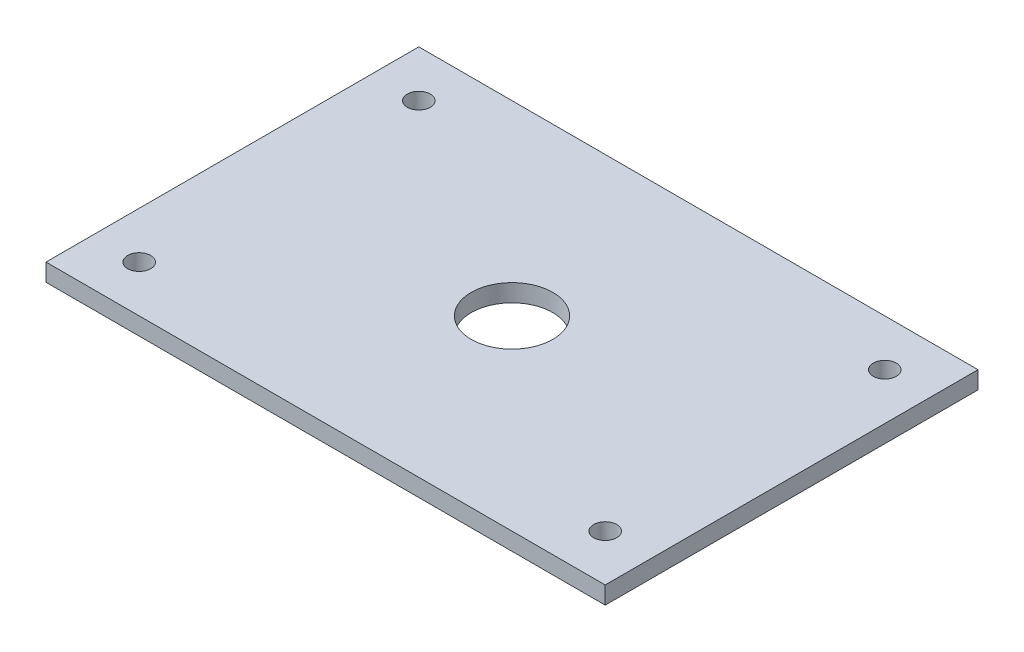
ISO-10303-21;
HEADER;
FILE_DESCRIPTION(('STEP AP214'),'2;1');
FILE_NAME('part.step','',(''),(''),'','','');
FILE_SCHEMA(('AUTOMOTIVE_DESIGN { 1 0 10303 214 1 1 1 1 }'));
ENDSEC;
DATA;
#1=APPLICATION_CONTEXT('core data for automotive mechanical design processes');
#2=APPLICATION_PROTOCOL_DEFINITION('international standard','automotive_design',2000,#1);
#3=PRODUCT_CONTEXT('',#1,'mechanical');
#4=PRODUCT('Part','Part','',(#3));
#5=PRODUCT_RELATED_PRODUCT_CATEGORY('part','',(#4));
#6=PRODUCT_DEFINITION_FORMATION('','',#4);
#7=PRODUCT_DEFINITION_CONTEXT('part definition',#1,'design');
#8=PRODUCT_DEFINITION('design','',#6,#7);
#9=PRODUCT_DEFINITION_SHAPE('','',#8);
#10=(LENGTH_UNIT() NAMED_UNIT(*) SI_UNIT(.MILLI.,.METRE.));
#11=(NAMED_UNIT(*) PLANE_ANGLE_UNIT() SI_UNIT($,.RADIAN.));
#12=(NAMED_UNIT(*) SI_UNIT($,.STERADIAN.) SOLID_ANGLE_UNIT());
#13=UNCERTAINTY_MEASURE_WITH_UNIT(LENGTH_MEASURE(1.E-05),#10,'distance_accuracy_value','');
#14=(GEOMETRIC_REPRESENTATION_CONTEXT(3) GLOBAL_UNCERTAINTY_ASSIGNED_CONTEXT((#13)) GLOBAL_UNIT_ASSIGNED_CONTEXT((#10,
#11,#12)) REPRESENTATION_CONTEXT('',''));
#15=CARTESIAN_POINT('',(0.,0.,0.));
#16=DIRECTION('',(0.,0.,1.));
#17=DIRECTION('',(1.,0.,0.));
#18=AXIS2_PLACEMENT_3D('',#15,#16,#17);
#19=CARTESIAN_POINT('',(-57.4360360360361,4.7752,-29.2900900900901));
#20=DIRECTION('',(1.,0.,0.));
#21=DIRECTION('',(0.,0.,-1.));
#22=AXIS2_PLACEMENT_3D('',#19,#20,#21);
#23=PLANE('',#22);
#24=DIRECTION('',(0.,0.,1.));
#25=VECTOR('',#24,1.);
#26=CARTESIAN_POINT('',(-57.4360360360361,0.,-29.2900900900901));
#27=LINE('',#26,#25);
#28=CARTESIAN_POINT('',(-57.4360360360361,0.,-29.2900900900901));
#29=VERTEX_POINT('',#28);
#30=CARTESIAN_POINT('',(-57.436036036036,0.,72.3099099099099));
#31=VERTEX_POINT('',#30);
#32=EDGE_CURVE('E99',#29,#31,#27,.T.);
#33=ORIENTED_EDGE('',*,*,#32,.T.);
#34=DIRECTION('',(0.,-1.,0.));
#35=VECTOR('',#34,1.);
#36=CARTESIAN_POINT('',(-57.436036036036,4.7752,72.3099099099099));
#37=LINE('',#36,#35);
#38=CARTESIAN_POINT('',(-57.436036036036,4.7752,72.3099099099099));
#39=VERTEX_POINT('',#38);
#40=EDGE_CURVE('E11',#39,#31,#37,.T.);
#41=ORIENTED_EDGE('',*,*,#40,.F.);
#42=DIRECTION('',(0.,0.,1.));
#43=VECTOR('',#42,1.);
#44=CARTESIAN_POINT('',(-57.4360360360361,4.7752,-29.2900900900901));
#45=LINE('',#44,#43);
#46=CARTESIAN_POINT('',(-57.4360360360361,4.7752,-29.2900900900901));
#47=VERTEX_POINT('',#46);
#48=EDGE_CURVE('E87',#47,#39,#45,.T.);
#49=ORIENTED_EDGE('',*,*,#48,.F.);
#50=DIRECTION('',(0.,-1.,0.));
#51=VECTOR('',#50,1.);
#52=CARTESIAN_POINT('',(-57.4360360360361,4.7752,-29.2900900900901));
#53=LINE('',#52,#51);
#54=EDGE_CURVE('E95',#47,#29,#53,.T.);
#55=ORIENTED_EDGE('',*,*,#54,.T.);
#56=EDGE_LOOP('',(#33,#41,#49,#55));
#57=FACE_BOUND('',#56,.T.);
#58=ADVANCED_FACE('F36',(#57),#23,.F.);
#59=CARTESIAN_POINT('',(-57.436036036036,4.7752,72.3099099099099));
#60=DIRECTION('',(0.,0.,-1.));
#61=DIRECTION('',(-1.,0.,0.));
#62=AXIS2_PLACEMENT_3D('',#59,#60,#61);
#63=PLANE('',#62);
#64=DIRECTION('',(1.,0.,0.));
#65=VECTOR('',#64,1.);
#66=CARTESIAN_POINT('',(-57.436036036036,0.,72.3099099099099));
#67=LINE('',#66,#65);
#68=CARTESIAN_POINT('',(94.9639639639639,0.,72.3099099099099));
#69=VERTEX_POINT('',#68);
#70=EDGE_CURVE('E91',#31,#69,#67,.T.);
#71=ORIENTED_EDGE('',*,*,#70,.T.);
#72=DIRECTION('',(0.,-1.,0.));
#73=VECTOR('',#72,1.);
#74=CARTESIAN_POINT('',(94.9639639639639,4.7752,72.3099099099099));
#75=LINE('',#74,#73);
#76=CARTESIAN_POINT('',(94.9639639639639,4.7752,72.3099099099099));
#77=VERTEX_POINT('',#76);
#78=EDGE_CURVE('E44',#77,#69,#75,.T.);
#79=ORIENTED_EDGE('',*,*,#78,.F.);
#80=DIRECTION('',(1.,0.,0.));
#81=VECTOR('',#80,1.);
#82=CARTESIAN_POINT('',(-57.436036036036,4.7752,72.3099099099099));
#83=LINE('',#82,#81);
#84=EDGE_CURVE('E82',#39,#77,#83,.T.);
#85=ORIENTED_EDGE('',*,*,#84,.F.);
#86=ORIENTED_EDGE('',*,*,#40,.T.);
#87=EDGE_LOOP('',(#71,#79,#85,#86));
#88=FACE_BOUND('',#87,.T.);
#89=ADVANCED_FACE('F90',(#88),#63,.F.);
#90=CARTESIAN_POINT('',(94.9639639639639,4.7752,-29.2900900900901));
#91=DIRECTION('',(-1.,0.,0.));
#92=DIRECTION('',(0.,0.,1.));
#93=AXIS2_PLACEMENT_3D('',#90,#91,#92);
#94=PLANE('',#93);
#95=DIRECTION('',(0.,0.,-1.));
#96=VECTOR('',#95,1.);
#97=CARTESIAN_POINT('',(94.9639639639639,0.,-29.2900900900901));
#98=LINE('',#97,#96);
#99=CARTESIAN_POINT('',(94.9639639639639,0.,-29.2900900900901));
#100=VERTEX_POINT('',#99);
#101=EDGE_CURVE('E69',#69,#100,#98,.T.);
#102=ORIENTED_EDGE('',*,*,#101,.T.);
#103=DIRECTION('',(0.,-1.,0.));
#104=VECTOR('',#103,1.);
#105=CARTESIAN_POINT('',(94.9639639639639,4.7752,-29.2900900900901));
#106=LINE('',#105,#104);
#107=CARTESIAN_POINT('',(94.9639639639639,4.7752,-29.2900900900901));
#108=VERTEX_POINT('',#107);
#109=EDGE_CURVE('E92',#108,#100,#106,.T.);
#110=ORIENTED_EDGE('',*,*,#109,.F.);
#111=DIRECTION('',(0.,0.,-1.));
#112=VECTOR('',#111,1.);
#113=CARTESIAN_POINT('',(94.9639639639639,4.7752,-29.2900900900901));
#114=LINE('',#113,#112);
#115=EDGE_CURVE('E85',#77,#108,#114,.T.);
#116=ORIENTED_EDGE('',*,*,#115,.F.);
#117=ORIENTED_EDGE('',*,*,#78,.T.);
#118=EDGE_LOOP('',(#102,#110,#116,#117));
#119=FACE_BOUND('',#118,.T.);
#120=ADVANCED_FACE('F93',(#119),#94,.F.);
#121=CARTESIAN_POINT('',(-57.4360360360361,4.7752,-29.2900900900901));
#122=DIRECTION('',(0.,0.,1.));
#123=DIRECTION('',(1.,0.,0.));
#124=AXIS2_PLACEMENT_3D('',#121,#122,#123);
#125=PLANE('',#124);
#126=DIRECTION('',(-1.,0.,0.));
#127=VECTOR('',#126,1.);
#128=CARTESIAN_POINT('',(-57.4360360360361,0.,-29.2900900900901));
#129=LINE('',#128,#127);
#130=EDGE_CURVE('E75',#100,#29,#129,.T.);
#131=ORIENTED_EDGE('',*,*,#130,.T.);
#132=ORIENTED_EDGE('',*,*,#54,.F.);
#133=DIRECTION('',(-1.,0.,0.));
#134=VECTOR('',#133,1.);
#135=CARTESIAN_POINT('',(-57.4360360360361,4.7752,-29.2900900900901));
#136=LINE('',#135,#134);
#137=EDGE_CURVE('E52',#108,#47,#136,.T.);
#138=ORIENTED_EDGE('',*,*,#137,.F.);
#139=ORIENTED_EDGE('',*,*,#109,.T.);
#140=EDGE_LOOP('',(#131,#132,#138,#139));
#141=FACE_BOUND('',#140,.T.);
#142=ADVANCED_FACE('F107',(#141),#125,.F.);
#143=CARTESIAN_POINT('',(0.,4.7752,0.));
#144=DIRECTION('',(0.,1.,0.));
#145=DIRECTION('',(0.,0.,1.));
#146=AXIS2_PLACEMENT_3D('',#143,#144,#145);
#147=PLANE('',#146);
#148=CARTESIAN_POINT('',(-44.7360360360353,4.7752,59.6099099099099));
#149=DIRECTION('',(0.,1.,0.));
#150=DIRECTION('',(0.,0.,1.));
#151=AXIS2_PLACEMENT_3D('',#148,#149,#150);
#152=CIRCLE('',#151,3.1369);
#153=CARTESIAN_POINT('',(-44.7360360360353,4.7752,62.7468099099099));
#154=VERTEX_POINT('',#153);
#155=EDGE_CURVE('E119',#154,#154,#152,.T.);
#156=ORIENTED_EDGE('',*,*,#155,.F.);
#157=EDGE_LOOP('',(#156));
#158=FACE_BOUND('',#157,.T.);
#159=CARTESIAN_POINT('',(82.2639639639648,4.7752,59.6099099099099));
#160=DIRECTION('',(0.,1.,0.));
#161=DIRECTION('',(0.,0.,1.));
#162=AXIS2_PLACEMENT_3D('',#159,#160,#161);
#163=CIRCLE('',#162,3.13689999999999);
#164=CARTESIAN_POINT('',(82.2639639639648,4.7752,62.7468099099099));
#165=VERTEX_POINT('',#164);
#166=EDGE_CURVE('E125',#165,#165,#163,.T.);
#167=ORIENTED_EDGE('',*,*,#166,.F.);
#168=EDGE_LOOP('',(#167));
#169=FACE_BOUND('',#168,.T.);
#170=CARTESIAN_POINT('',(82.2639639639639,4.7752,-16.5900900900901));
#171=DIRECTION('',(0.,1.,0.));
#172=DIRECTION('',(0.,0.,1.));
#173=AXIS2_PLACEMENT_3D('',#170,#171,#172);
#174=CIRCLE('',#173,3.13689999999999);
#175=CARTESIAN_POINT('',(82.2639639639639,4.7752,-13.4531900900901));
#176=VERTEX_POINT('',#175);
#177=EDGE_CURVE('E131',#176,#176,#174,.T.);
#178=ORIENTED_EDGE('',*,*,#177,.F.);
#179=EDGE_LOOP('',(#178));
#180=FACE_BOUND('',#179,.T.);
#181=CARTESIAN_POINT('',(18.7639639639639,4.7752,21.5099099099099));
#182=DIRECTION('',(0.,1.,0.));
#183=DIRECTION('',(0.,0.,1.));
#184=AXIS2_PLACEMENT_3D('',#181,#182,#183);
#185=CIRCLE('',#184,11.1125);
#186=CARTESIAN_POINT('',(18.7639639639639,4.7752,32.6224099099099));
#187=VERTEX_POINT('',#186);
#188=EDGE_CURVE('E137',#187,#187,#185,.T.);
#189=ORIENTED_EDGE('',*,*,#188,.F.);
#190=EDGE_LOOP('',(#189));
#191=FACE_BOUND('',#190,.T.);
#192=CARTESIAN_POINT('',(-44.7360360360361,4.7752,-16.5900900900901));
#193=DIRECTION('',(0.,1.,0.));
#194=DIRECTION('',(0.,0.,1.));
#195=AXIS2_PLACEMENT_3D('',#192,#193,#194);
#196=CIRCLE('',#195,3.1369);
#197=CARTESIAN_POINT('',(-44.7360360360361,4.7752,-13.4531900900901));
#198=VERTEX_POINT('',#197);
#199=EDGE_CURVE('E113',#198,#198,#196,.T.);
#200=ORIENTED_EDGE('',*,*,#199,.F.);
#201=EDGE_LOOP('',(#200));
#202=FACE_BOUND('',#201,.T.);
#203=ORIENTED_EDGE('',*,*,#48,.T.);
#204=ORIENTED_EDGE('',*,*,#84,.T.);
#205=ORIENTED_EDGE('',*,*,#115,.T.);
#206=ORIENTED_EDGE('',*,*,#137,.T.);
#207=EDGE_LOOP('',(#203,#204,#205,#206));
#208=FACE_BOUND('',#207,.T.);
#209=ADVANCED_FACE('F83',(#158,#169,#180,#191,#202,#208),#147,.T.);
#210=CARTESIAN_POINT('',(0.,0.,0.));
#211=DIRECTION('',(0.,1.,0.));
#212=DIRECTION('',(0.,0.,1.));
#213=AXIS2_PLACEMENT_3D('',#210,#211,#212);
#214=PLANE('',#213);
#215=CARTESIAN_POINT('',(-44.7360360360353,0.,59.6099099099099));
#216=DIRECTION('',(0.,1.,0.));
#217=DIRECTION('',(0.,0.,1.));
#218=AXIS2_PLACEMENT_3D('',#215,#216,#217);
#219=CIRCLE('',#218,3.1369);
#220=CARTESIAN_POINT('',(-44.7360360360353,0.,62.7468099099099));
#221=VERTEX_POINT('',#220);
#222=EDGE_CURVE('E122',#221,#221,#219,.T.);
#223=ORIENTED_EDGE('',*,*,#222,.T.);
#224=EDGE_LOOP('',(#223));
#225=FACE_BOUND('',#224,.T.);
#226=CARTESIAN_POINT('',(82.2639639639648,0.,59.6099099099099));
#227=DIRECTION('',(0.,1.,0.));
#228=DIRECTION('',(0.,0.,1.));
#229=AXIS2_PLACEMENT_3D('',#226,#227,#228);
#230=CIRCLE('',#229,3.13689999999999);
#231=CARTESIAN_POINT('',(82.2639639639648,0.,62.7468099099099));
#232=VERTEX_POINT('',#231);
#233=EDGE_CURVE('E128',#232,#232,#230,.T.);
#234=ORIENTED_EDGE('',*,*,#233,.T.);
#235=EDGE_LOOP('',(#234));
#236=FACE_BOUND('',#235,.T.);
#237=CARTESIAN_POINT('',(82.2639639639639,0.,-16.5900900900901));
#238=DIRECTION('',(0.,1.,0.));
#239=DIRECTION('',(0.,0.,1.));
#240=AXIS2_PLACEMENT_3D('',#237,#238,#239);
#241=CIRCLE('',#240,3.13689999999999);
#242=CARTESIAN_POINT('',(82.2639639639639,0.,-13.4531900900901));
#243=VERTEX_POINT('',#242);
#244=EDGE_CURVE('E134',#243,#243,#241,.T.);
#245=ORIENTED_EDGE('',*,*,#244,.T.);
#246=EDGE_LOOP('',(#245));
#247=FACE_BOUND('',#246,.T.);
#248=CARTESIAN_POINT('',(18.7639639639639,0.,21.5099099099099));
#249=DIRECTION('',(0.,1.,0.));
#250=DIRECTION('',(0.,0.,1.));
#251=AXIS2_PLACEMENT_3D('',#248,#249,#250);
#252=CIRCLE('',#251,11.1125);
#253=CARTESIAN_POINT('',(18.7639639639639,0.,32.6224099099099));
#254=VERTEX_POINT('',#253);
#255=EDGE_CURVE('E116',#254,#254,#252,.T.);
#256=ORIENTED_EDGE('',*,*,#255,.T.);
#257=EDGE_LOOP('',(#256));
#258=FACE_BOUND('',#257,.T.);
#259=CARTESIAN_POINT('',(-44.7360360360361,0.,-16.5900900900901));
#260=DIRECTION('',(0.,1.,0.));
#261=DIRECTION('',(0.,0.,1.));
#262=AXIS2_PLACEMENT_3D('',#259,#260,#261);
#263=CIRCLE('',#262,3.1369);
#264=CARTESIAN_POINT('',(-44.7360360360361,0.,-13.4531900900901));
#265=VERTEX_POINT('',#264);
#266=EDGE_CURVE('E102',#265,#265,#263,.T.);
#267=ORIENTED_EDGE('',*,*,#266,.T.);
#268=EDGE_LOOP('',(#267));
#269=FACE_BOUND('',#268,.T.);
#270=ORIENTED_EDGE('',*,*,#32,.F.);
#271=ORIENTED_EDGE('',*,*,#130,.F.);
#272=ORIENTED_EDGE('',*,*,#101,.F.);
#273=ORIENTED_EDGE('',*,*,#70,.F.);
#274=EDGE_LOOP('',(#270,#271,#272,#273));
#275=FACE_BOUND('',#274,.T.);
#276=ADVANCED_FACE('F110',(#225,#236,#247,#258,#269,#275),#214,.F.);
#277=CARTESIAN_POINT('',(-44.7360360360361,0.,-16.5900900900901));
#278=DIRECTION('',(0.,1.,0.));
#279=DIRECTION('',(0.,0.,1.));
#280=AXIS2_PLACEMENT_3D('',#277,#278,#279);
#281=CYLINDRICAL_SURFACE('',#280,3.1369);
#282=ORIENTED_EDGE('',*,*,#266,.F.);
#283=EDGE_LOOP('',(#282));
#284=FACE_BOUND('',#283,.T.);
#285=ORIENTED_EDGE('',*,*,#199,.T.);
#286=EDGE_LOOP('',(#285));
#287=FACE_BOUND('',#286,.T.);
#288=ADVANCED_FACE('F149',(#284,#287),#281,.F.);
#289=CARTESIAN_POINT('',(18.7639639639639,0.,21.5099099099099));
#290=DIRECTION('',(0.,1.,0.));
#291=DIRECTION('',(0.,0.,1.));
#292=AXIS2_PLACEMENT_3D('',#289,#290,#291);
#293=CYLINDRICAL_SURFACE('',#292,11.1125);
#294=ORIENTED_EDGE('',*,*,#255,.F.);
#295=EDGE_LOOP('',(#294));
#296=FACE_BOUND('',#295,.T.);
#297=ORIENTED_EDGE('',*,*,#188,.T.);
#298=EDGE_LOOP('',(#297));
#299=FACE_BOUND('',#298,.T.);
#300=ADVANCED_FACE('F145',(#296,#299),#293,.F.);
#301=CARTESIAN_POINT('',(82.2639639639639,0.,-16.5900900900901));
#302=DIRECTION('',(0.,1.,0.));
#303=DIRECTION('',(0.,0.,1.));
#304=AXIS2_PLACEMENT_3D('',#301,#302,#303);
#305=CYLINDRICAL_SURFACE('',#304,3.13689999999999);
#306=ORIENTED_EDGE('',*,*,#244,.F.);
#307=EDGE_LOOP('',(#306));
#308=FACE_BOUND('',#307,.T.);
#309=ORIENTED_EDGE('',*,*,#177,.T.);
#310=EDGE_LOOP('',(#309));
#311=FACE_BOUND('',#310,.T.);
#312=ADVANCED_FACE('F148',(#308,#311),#305,.F.);
#313=CARTESIAN_POINT('',(82.2639639639648,0.,59.6099099099099));
#314=DIRECTION('',(0.,1.,0.));
#315=DIRECTION('',(0.,0.,1.));
#316=AXIS2_PLACEMENT_3D('',#313,#314,#315);
#317=CYLINDRICAL_SURFACE('',#316,3.13689999999999);
#318=ORIENTED_EDGE('',*,*,#233,.F.);
#319=EDGE_LOOP('',(#318));
#320=FACE_BOUND('',#319,.T.);
#321=ORIENTED_EDGE('',*,*,#166,.T.);
#322=EDGE_LOOP('',(#321));
#323=FACE_BOUND('',#322,.T.);
#324=ADVANCED_FACE('F210',(#320,#323),#317,.F.);
#325=CARTESIAN_POINT('',(-44.7360360360353,0.,59.6099099099099));
#326=DIRECTION('',(0.,1.,0.));
#327=DIRECTION('',(0.,0.,1.));
#328=AXIS2_PLACEMENT_3D('',#325,#326,#327);
#329=CYLINDRICAL_SURFACE('',#328,3.1369);
#330=ORIENTED_EDGE('',*,*,#222,.F.);
#331=EDGE_LOOP('',(#330));
#332=FACE_BOUND('',#331,.T.);
#333=ORIENTED_EDGE('',*,*,#155,.T.);
#334=EDGE_LOOP('',(#333));
#335=FACE_BOUND('',#334,.T.);
#336=ADVANCED_FACE('F220',(#332,#335),#329,.F.);
#337=CLOSED_SHELL('',(#58,#89,#120,#142,#209,#276,#288,#300,#312,#324,#336));
#338=MANIFOLD_SOLID_BREP('B2',#337);
#339=ADVANCED_BREP_SHAPE_REPRESENTATION('',(#18,#338),#14);
#340=SHAPE_DEFINITION_REPRESENTATION(#9,#339);
ENDSEC;
END-ISO-10303-21;
